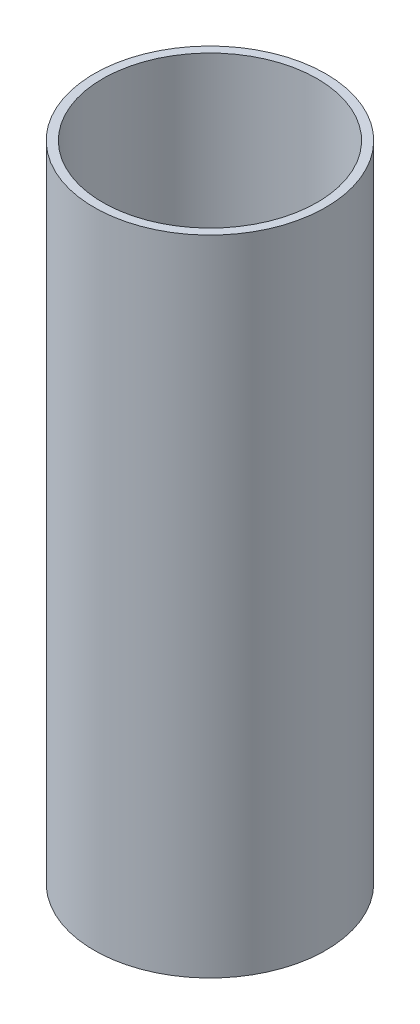
ISO-10303-21;
HEADER;
FILE_DESCRIPTION(('STEP AP214'),'2;1');
FILE_NAME('part.step','',(''),(''),'','','');
FILE_SCHEMA(('AUTOMOTIVE_DESIGN { 1 0 10303 214 1 1 1 1 }'));
ENDSEC;
DATA;
#1=APPLICATION_CONTEXT('core data for automotive mechanical design processes');
#2=APPLICATION_PROTOCOL_DEFINITION('international standard','automotive_design',2000,#1);
#3=PRODUCT_CONTEXT('',#1,'mechanical');
#4=PRODUCT('Part','Part','',(#3));
#5=PRODUCT_RELATED_PRODUCT_CATEGORY('part','',(#4));
#6=PRODUCT_DEFINITION_FORMATION('','',#4);
#7=PRODUCT_DEFINITION_CONTEXT('part definition',#1,'design');
#8=PRODUCT_DEFINITION('design','',#6,#7);
#9=PRODUCT_DEFINITION_SHAPE('','',#8);
#10=(LENGTH_UNIT() NAMED_UNIT(*) SI_UNIT(.MILLI.,.METRE.));
#11=(NAMED_UNIT(*) PLANE_ANGLE_UNIT() SI_UNIT($,.RADIAN.));
#12=(NAMED_UNIT(*) SI_UNIT($,.STERADIAN.) SOLID_ANGLE_UNIT());
#13=UNCERTAINTY_MEASURE_WITH_UNIT(LENGTH_MEASURE(1.E-05),#10,'distance_accuracy_value','');
#14=(GEOMETRIC_REPRESENTATION_CONTEXT(3) GLOBAL_UNCERTAINTY_ASSIGNED_CONTEXT((#13)) GLOBAL_UNIT_ASSIGNED_CONTEXT((#10,
#11,#12)) REPRESENTATION_CONTEXT('',''));
#15=CARTESIAN_POINT('',(0.,0.,0.));
#16=DIRECTION('',(0.,0.,1.));
#17=DIRECTION('',(1.,0.,0.));
#18=AXIS2_PLACEMENT_3D('',#15,#16,#17);
#19=CARTESIAN_POINT('',(0.,76.2,0.));
#20=DIRECTION('',(0.,1.,0.));
#21=DIRECTION('',(0.,0.,1.));
#22=AXIS2_PLACEMENT_3D('',#19,#20,#21);
#23=PLANE('',#22);
#24=CARTESIAN_POINT('',(0.,76.2,0.));
#25=DIRECTION('',(0.,1.,0.));
#26=DIRECTION('',(0.,0.,1.));
#27=AXIS2_PLACEMENT_3D('',#24,#25,#26);
#28=CIRCLE('',#27,13.716);
#29=CARTESIAN_POINT('',(0.,76.2,-13.716));
#30=VERTEX_POINT('',#29);
#31=EDGE_CURVE('E10',#30,#30,#28,.T.);
#32=ORIENTED_EDGE('',*,*,#31,.T.);
#33=EDGE_LOOP('',(#32));
#34=FACE_BOUND('',#33,.T.);
#35=CARTESIAN_POINT('',(0.,76.2,0.));
#36=DIRECTION('',(0.,1.,0.));
#37=DIRECTION('',(0.,0.,1.));
#38=AXIS2_PLACEMENT_3D('',#35,#36,#37);
#39=CIRCLE('',#38,12.7);
#40=CARTESIAN_POINT('',(0.,76.2,-12.7));
#41=VERTEX_POINT('',#40);
#42=EDGE_CURVE('E41',#41,#41,#39,.T.);
#43=ORIENTED_EDGE('',*,*,#42,.F.);
#44=EDGE_LOOP('',(#43));
#45=FACE_BOUND('',#44,.T.);
#46=ADVANCED_FACE('F30',(#34,#45),#23,.T.);
#47=CARTESIAN_POINT('',(0.,0.,0.));
#48=DIRECTION('',(0.,1.,0.));
#49=DIRECTION('',(0.,0.,1.));
#50=AXIS2_PLACEMENT_3D('',#47,#48,#49);
#51=PLANE('',#50);
#52=CARTESIAN_POINT('',(0.,0.,0.));
#53=DIRECTION('',(0.,1.,0.));
#54=DIRECTION('',(0.,0.,1.));
#55=AXIS2_PLACEMENT_3D('',#52,#53,#54);
#56=CIRCLE('',#55,13.716);
#57=CARTESIAN_POINT('',(0.,0.,-13.716));
#58=VERTEX_POINT('',#57);
#59=EDGE_CURVE('E34',#58,#58,#56,.T.);
#60=ORIENTED_EDGE('',*,*,#59,.F.);
#61=EDGE_LOOP('',(#60));
#62=FACE_BOUND('',#61,.T.);
#63=CARTESIAN_POINT('',(0.,0.,0.));
#64=DIRECTION('',(0.,1.,0.));
#65=DIRECTION('',(0.,0.,1.));
#66=AXIS2_PLACEMENT_3D('',#63,#64,#65);
#67=CIRCLE('',#66,12.7);
#68=CARTESIAN_POINT('',(0.,0.,-12.7));
#69=VERTEX_POINT('',#68);
#70=EDGE_CURVE('E43',#69,#69,#67,.T.);
#71=ORIENTED_EDGE('',*,*,#70,.T.);
#72=EDGE_LOOP('',(#71));
#73=FACE_BOUND('',#72,.T.);
#74=ADVANCED_FACE('F53',(#62,#73),#51,.F.);
#75=CARTESIAN_POINT('',(0.,76.2,0.));
#76=DIRECTION('',(0.,-1.,0.));
#77=DIRECTION('',(0.,0.,-1.));
#78=AXIS2_PLACEMENT_3D('',#75,#76,#77);
#79=CYLINDRICAL_SURFACE('',#78,13.716);
#80=CARTESIAN_POINT('',(0.,76.2,-13.716));
#81=CARTESIAN_POINT('',(0.,75.40625,-13.716));
#82=CARTESIAN_POINT('',(0.,74.6125,-13.716));
#83=CARTESIAN_POINT('',(0.,73.025,-13.716));
#84=CARTESIAN_POINT('',(0.,72.23125,-13.716));
#85=CARTESIAN_POINT('',(0.,70.64375,-13.716));
#86=CARTESIAN_POINT('',(0.,69.85,-13.716));
#87=CARTESIAN_POINT('',(0.,68.2625,-13.716));
#88=CARTESIAN_POINT('',(0.,67.46875,-13.716));
#89=CARTESIAN_POINT('',(0.,65.88125,-13.716));
#90=CARTESIAN_POINT('',(0.,65.0875,-13.716));
#91=CARTESIAN_POINT('',(0.,63.5,-13.716));
#92=CARTESIAN_POINT('',(0.,62.70625,-13.716));
#93=CARTESIAN_POINT('',(0.,61.11875,-13.716));
#94=CARTESIAN_POINT('',(0.,60.325,-13.716));
#95=CARTESIAN_POINT('',(0.,58.7375,-13.716));
#96=CARTESIAN_POINT('',(0.,57.94375,-13.716));
#97=CARTESIAN_POINT('',(0.,56.35625,-13.716));
#98=CARTESIAN_POINT('',(0.,55.5625,-13.716));
#99=CARTESIAN_POINT('',(0.,53.975,-13.716));
#100=CARTESIAN_POINT('',(0.,53.18125,-13.716));
#101=CARTESIAN_POINT('',(0.,51.59375,-13.716));
#102=CARTESIAN_POINT('',(0.,50.8,-13.716));
#103=CARTESIAN_POINT('',(0.,49.2125,-13.716));
#104=CARTESIAN_POINT('',(0.,48.41875,-13.716));
#105=CARTESIAN_POINT('',(0.,46.83125,-13.716));
#106=CARTESIAN_POINT('',(0.,46.0375,-13.716));
#107=CARTESIAN_POINT('',(0.,44.45,-13.716));
#108=CARTESIAN_POINT('',(0.,43.65625,-13.716));
#109=CARTESIAN_POINT('',(0.,42.06875,-13.716));
#110=CARTESIAN_POINT('',(0.,41.275,-13.716));
#111=CARTESIAN_POINT('',(0.,39.6875,-13.716));
#112=CARTESIAN_POINT('',(0.,38.89375,-13.716));
#113=CARTESIAN_POINT('',(0.,37.30625,-13.716));
#114=CARTESIAN_POINT('',(0.,36.5125,-13.716));
#115=CARTESIAN_POINT('',(0.,34.925,-13.716));
#116=CARTESIAN_POINT('',(0.,34.13125,-13.716));
#117=CARTESIAN_POINT('',(0.,32.54375,-13.716));
#118=CARTESIAN_POINT('',(0.,31.75,-13.716));
#119=CARTESIAN_POINT('',(0.,30.1625,-13.716));
#120=CARTESIAN_POINT('',(0.,29.36875,-13.716));
#121=CARTESIAN_POINT('',(0.,27.78125,-13.716));
#122=CARTESIAN_POINT('',(0.,26.9875,-13.716));
#123=CARTESIAN_POINT('',(0.,25.4,-13.716));
#124=CARTESIAN_POINT('',(0.,24.60625,-13.716));
#125=CARTESIAN_POINT('',(0.,23.01875,-13.716));
#126=CARTESIAN_POINT('',(0.,22.225,-13.716));
#127=CARTESIAN_POINT('',(0.,20.6375,-13.716));
#128=CARTESIAN_POINT('',(0.,19.84375,-13.716));
#129=CARTESIAN_POINT('',(0.,18.25625,-13.716));
#130=CARTESIAN_POINT('',(0.,17.4625,-13.716));
#131=CARTESIAN_POINT('',(0.,15.875,-13.716));
#132=CARTESIAN_POINT('',(0.,15.08125,-13.716));
#133=CARTESIAN_POINT('',(0.,13.49375,-13.716));
#134=CARTESIAN_POINT('',(0.,12.7,-13.716));
#135=CARTESIAN_POINT('',(0.,11.1125,-13.716));
#136=CARTESIAN_POINT('',(0.,10.31875,-13.716));
#137=CARTESIAN_POINT('',(0.,8.73125,-13.716));
#138=CARTESIAN_POINT('',(0.,7.93750000000001,-13.716));
#139=CARTESIAN_POINT('',(0.,6.35,-13.716));
#140=CARTESIAN_POINT('',(0.,5.55625,-13.716));
#141=CARTESIAN_POINT('',(0.,3.96875,-13.716));
#142=CARTESIAN_POINT('',(0.,3.175,-13.716));
#143=CARTESIAN_POINT('',(0.,1.5875,-13.716));
#144=CARTESIAN_POINT('',(0.,0.793750000000001,-13.716));
#145=CARTESIAN_POINT('',(0.,0.,-13.716));
#146=B_SPLINE_CURVE_WITH_KNOTS('',3,(#80,#81,#82,#83,#84,#85,#86,#87,#88,#89,#90,#91,#92,#93,
#94,#95,#96,#97,#98,#99,#100,#101,#102,#103,#104,#105,#106,#107,#108,#109,#110,#111,#112,#113,
#114,#115,#116,#117,#118,#119,#120,#121,#122,#123,#124,#125,#126,#127,#128,#129,#130,#131,#132,
#133,#134,#135,#136,#137,#138,#139,#140,#141,#142,#143,#144,#145),.UNSPECIFIED.,.F.,.F.,(4,2,2,
2,2,2,2,2,2,2,2,2,2,2,2,2,2,2,2,2,2,2,2,2,2,2,2,2,2,2,2,2,4),(0.,2.38125,4.7625,7.14375,
9.52500000000001,11.90625,14.2875,16.66875,19.05,21.43125,23.8125,26.19375,28.575,30.95625,
33.3375,35.71875,38.1,40.48125,42.8625,45.24375,47.625,50.00625,52.3875,54.76875,57.15,59.53125,
61.9125,64.29375,66.675,69.05625,71.4375,73.81875,76.2),.UNSPECIFIED.);
#147=EDGE_CURVE('BSEAM32',#30,#58,#146,.T.);
#148=ORIENTED_EDGE('',*,*,#31,.F.);
#149=ORIENTED_EDGE('',*,*,#59,.T.);
#150=ORIENTED_EDGE('',*,*,#147,.T.);
#151=ORIENTED_EDGE('',*,*,#147,.F.);
#152=EDGE_LOOP('',(#148,#150,#149,#151));
#153=FACE_BOUND('',#152,.T.);
#154=ADVANCED_FACE('F32',(#153),#79,.T.);
#155=CARTESIAN_POINT('',(0.,76.2,0.));
#156=DIRECTION('',(0.,-1.,0.));
#157=DIRECTION('',(0.,0.,-1.));
#158=AXIS2_PLACEMENT_3D('',#155,#156,#157);
#159=CYLINDRICAL_SURFACE('',#158,12.7);
#160=CARTESIAN_POINT('',(0.,76.2,-12.7));
#161=CARTESIAN_POINT('',(0.,75.40625,-12.7));
#162=CARTESIAN_POINT('',(0.,74.6125,-12.7));
#163=CARTESIAN_POINT('',(0.,73.025,-12.7));
#164=CARTESIAN_POINT('',(0.,72.23125,-12.7));
#165=CARTESIAN_POINT('',(0.,70.64375,-12.7));
#166=CARTESIAN_POINT('',(0.,69.85,-12.7));
#167=CARTESIAN_POINT('',(0.,68.2625,-12.7));
#168=CARTESIAN_POINT('',(0.,67.46875,-12.7));
#169=CARTESIAN_POINT('',(0.,65.88125,-12.7));
#170=CARTESIAN_POINT('',(0.,65.0875,-12.7));
#171=CARTESIAN_POINT('',(0.,63.5,-12.7));
#172=CARTESIAN_POINT('',(0.,62.70625,-12.7));
#173=CARTESIAN_POINT('',(0.,61.11875,-12.7));
#174=CARTESIAN_POINT('',(0.,60.325,-12.7));
#175=CARTESIAN_POINT('',(0.,58.7375,-12.7));
#176=CARTESIAN_POINT('',(0.,57.94375,-12.7));
#177=CARTESIAN_POINT('',(0.,56.35625,-12.7));
#178=CARTESIAN_POINT('',(0.,55.5625,-12.7));
#179=CARTESIAN_POINT('',(0.,53.975,-12.7));
#180=CARTESIAN_POINT('',(0.,53.18125,-12.7));
#181=CARTESIAN_POINT('',(0.,51.59375,-12.7));
#182=CARTESIAN_POINT('',(0.,50.8,-12.7));
#183=CARTESIAN_POINT('',(0.,49.2125,-12.7));
#184=CARTESIAN_POINT('',(0.,48.41875,-12.7));
#185=CARTESIAN_POINT('',(0.,46.83125,-12.7));
#186=CARTESIAN_POINT('',(0.,46.0375,-12.7));
#187=CARTESIAN_POINT('',(0.,44.45,-12.7));
#188=CARTESIAN_POINT('',(0.,43.65625,-12.7));
#189=CARTESIAN_POINT('',(0.,42.06875,-12.7));
#190=CARTESIAN_POINT('',(0.,41.275,-12.7));
#191=CARTESIAN_POINT('',(0.,39.6875,-12.7));
#192=CARTESIAN_POINT('',(0.,38.89375,-12.7));
#193=CARTESIAN_POINT('',(0.,37.30625,-12.7));
#194=CARTESIAN_POINT('',(0.,36.5125,-12.7));
#195=CARTESIAN_POINT('',(0.,34.925,-12.7));
#196=CARTESIAN_POINT('',(0.,34.13125,-12.7));
#197=CARTESIAN_POINT('',(0.,32.54375,-12.7));
#198=CARTESIAN_POINT('',(0.,31.75,-12.7));
#199=CARTESIAN_POINT('',(0.,30.1625,-12.7));
#200=CARTESIAN_POINT('',(0.,29.36875,-12.7));
#201=CARTESIAN_POINT('',(0.,27.78125,-12.7));
#202=CARTESIAN_POINT('',(0.,26.9875,-12.7));
#203=CARTESIAN_POINT('',(0.,25.4,-12.7));
#204=CARTESIAN_POINT('',(0.,24.60625,-12.7));
#205=CARTESIAN_POINT('',(0.,23.01875,-12.7));
#206=CARTESIAN_POINT('',(0.,22.225,-12.7));
#207=CARTESIAN_POINT('',(0.,20.6375,-12.7));
#208=CARTESIAN_POINT('',(0.,19.84375,-12.7));
#209=CARTESIAN_POINT('',(0.,18.25625,-12.7));
#210=CARTESIAN_POINT('',(0.,17.4625,-12.7));
#211=CARTESIAN_POINT('',(0.,15.875,-12.7));
#212=CARTESIAN_POINT('',(0.,15.08125,-12.7));
#213=CARTESIAN_POINT('',(0.,13.49375,-12.7));
#214=CARTESIAN_POINT('',(0.,12.7,-12.7));
#215=CARTESIAN_POINT('',(0.,11.1125,-12.7));
#216=CARTESIAN_POINT('',(0.,10.31875,-12.7));
#217=CARTESIAN_POINT('',(0.,8.73125,-12.7));
#218=CARTESIAN_POINT('',(0.,7.93750000000001,-12.7));
#219=CARTESIAN_POINT('',(0.,6.35,-12.7));
#220=CARTESIAN_POINT('',(0.,5.55625,-12.7));
#221=CARTESIAN_POINT('',(0.,3.96875,-12.7));
#222=CARTESIAN_POINT('',(0.,3.175,-12.7));
#223=CARTESIAN_POINT('',(0.,1.5875,-12.7));
#224=CARTESIAN_POINT('',(0.,0.793750000000001,-12.7));
#225=CARTESIAN_POINT('',(0.,0.,-12.7));
#226=B_SPLINE_CURVE_WITH_KNOTS('',3,(#160,#161,#162,#163,#164,#165,#166,#167,#168,#169,#170,
#171,#172,#173,#174,#175,#176,#177,#178,#179,#180,#181,#182,#183,#184,#185,#186,#187,#188,#189,
#190,#191,#192,#193,#194,#195,#196,#197,#198,#199,#200,#201,#202,#203,#204,#205,#206,#207,#208,
#209,#210,#211,#212,#213,#214,#215,#216,#217,#218,#219,#220,#221,#222,#223,#224,#225),
.UNSPECIFIED.,.F.,.F.,(4,2,2,2,2,2,2,2,2,2,2,2,2,2,2,2,2,2,2,2,2,2,2,2,2,2,2,2,2,2,2,2,4),(0.,
2.38124999999999,4.76249999999999,7.14374999999999,9.52499999999999,11.90625,14.2875,16.66875,
19.05,21.43125,23.8125,26.19375,28.575,30.95625,33.3375,35.71875,38.1,40.48125,42.8625,45.24375,
47.625,50.00625,52.3875,54.76875,57.15,59.53125,61.9125,64.29375,66.675,69.05625,71.4375,
73.81875,76.2),.UNSPECIFIED.);
#227=EDGE_CURVE('BSEAM49',#41,#69,#226,.T.);
#228=ORIENTED_EDGE('',*,*,#42,.T.);
#229=ORIENTED_EDGE('',*,*,#70,.F.);
#230=ORIENTED_EDGE('',*,*,#227,.T.);
#231=ORIENTED_EDGE('',*,*,#227,.F.);
#232=EDGE_LOOP('',(#228,#230,#229,#231));
#233=FACE_BOUND('',#232,.T.);
#234=ADVANCED_FACE('F49',(#233),#159,.F.);
#235=CLOSED_SHELL('',(#46,#74,#154,#234));
#236=MANIFOLD_SOLID_BREP('B2',#235);
#237=ADVANCED_BREP_SHAPE_REPRESENTATION('',(#18,#236),#14);
#238=SHAPE_DEFINITION_REPRESENTATION(#9,#237);
ENDSEC;
END-ISO-10303-21;
